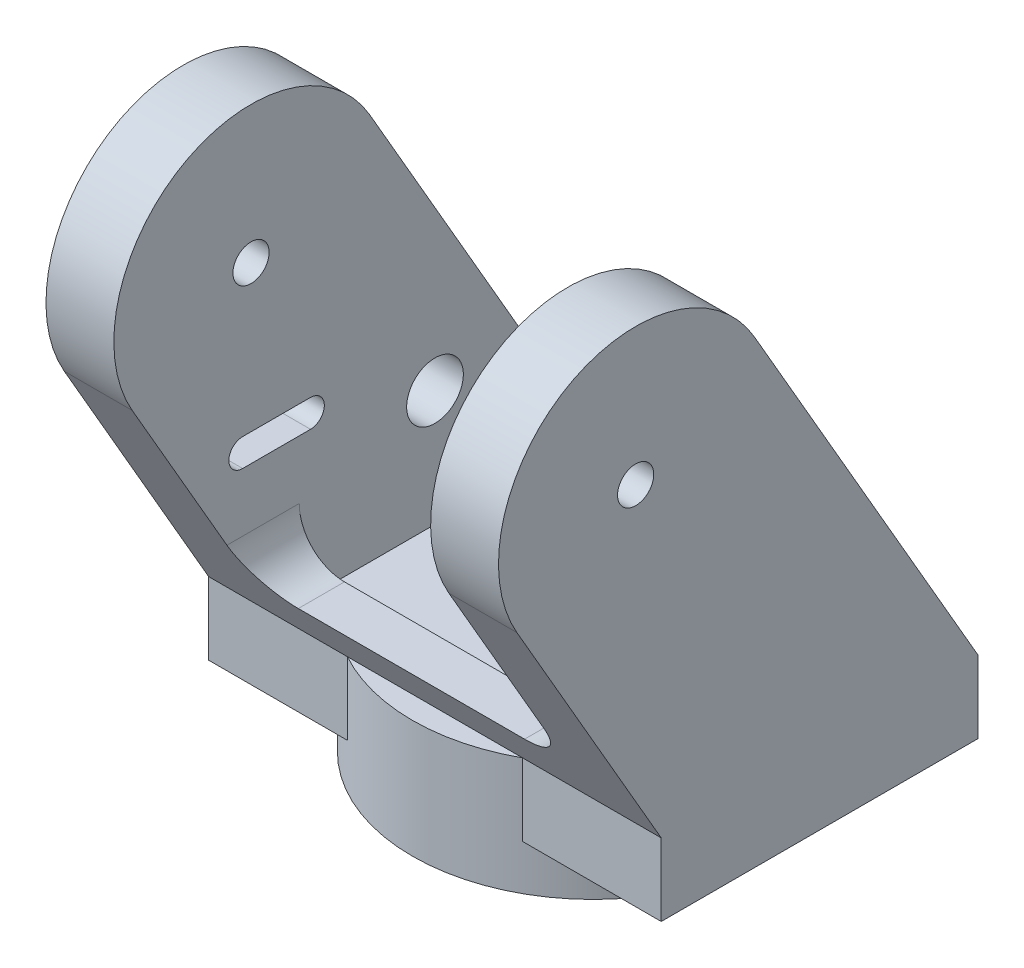
ISO-10303-21;
HEADER;
FILE_DESCRIPTION(('STEP AP214'),'2;1');
FILE_NAME('part.step','',(''),(''),'','','');
FILE_SCHEMA(('AUTOMOTIVE_DESIGN { 1 0 10303 214 1 1 1 1 }'));
ENDSEC;
DATA;
#1=APPLICATION_CONTEXT('core data for automotive mechanical design processes');
#2=APPLICATION_PROTOCOL_DEFINITION('international standard','automotive_design',2000,#1);
#3=PRODUCT_CONTEXT('',#1,'mechanical');
#4=PRODUCT('Part','Part','',(#3));
#5=PRODUCT_RELATED_PRODUCT_CATEGORY('part','',(#4));
#6=PRODUCT_DEFINITION_FORMATION('','',#4);
#7=PRODUCT_DEFINITION_CONTEXT('part definition',#1,'design');
#8=PRODUCT_DEFINITION('design','',#6,#7);
#9=PRODUCT_DEFINITION_SHAPE('','',#8);
#10=(LENGTH_UNIT() NAMED_UNIT(*) SI_UNIT(.MILLI.,.METRE.));
#11=(NAMED_UNIT(*) PLANE_ANGLE_UNIT() SI_UNIT($,.RADIAN.));
#12=(NAMED_UNIT(*) SI_UNIT($,.STERADIAN.) SOLID_ANGLE_UNIT());
#13=UNCERTAINTY_MEASURE_WITH_UNIT(LENGTH_MEASURE(1.E-05),#10,'distance_accuracy_value','');
#14=(GEOMETRIC_REPRESENTATION_CONTEXT(3) GLOBAL_UNCERTAINTY_ASSIGNED_CONTEXT((#13)) GLOBAL_UNIT_ASSIGNED_CONTEXT((#10,
#11,#12)) REPRESENTATION_CONTEXT('',''));
#15=CARTESIAN_POINT('',(0.,0.,0.));
#16=DIRECTION('',(0.,0.,1.));
#17=DIRECTION('',(1.,0.,0.));
#18=AXIS2_PLACEMENT_3D('',#15,#16,#17);
#19=CARTESIAN_POINT('',(0.,26.,0.));
#20=DIRECTION('',(0.,1.,0.));
#21=DIRECTION('',(0.,0.,1.));
#22=AXIS2_PLACEMENT_3D('',#19,#20,#21);
#23=PLANE('',#22);
#24=CARTESIAN_POINT('',(0.,26.,0.));
#25=DIRECTION('',(0.,1.,0.));
#26=DIRECTION('',(0.,0.,1.));
#27=AXIS2_PLACEMENT_3D('',#24,#25,#26);
#28=CIRCLE('',#27,40.);
#29=CARTESIAN_POINT('',(-19.3649167310371,26.,35.));
#30=VERTEX_POINT('',#29);
#31=CARTESIAN_POINT('',(19.3649167310371,26.,35.));
#32=VERTEX_POINT('',#31);
#33=EDGE_CURVE('E250',#30,#32,#28,.T.);
#34=ORIENTED_EDGE('',*,*,#33,.T.);
#35=DIRECTION('',(-1.,0.,0.));
#36=VECTOR('',#35,1.);
#37=CARTESIAN_POINT('',(50.,26.,35.));
#38=LINE('',#37,#36);
#39=EDGE_CURVE('E192',#32,#30,#38,.T.);
#40=ORIENTED_EDGE('',*,*,#39,.T.);
#41=EDGE_LOOP('',(#34,#40));
#42=FACE_BOUND('',#41,.T.);
#43=ADVANCED_FACE('F35',(#42),#23,.T.);
#44=DIRECTION('',(0.,0.,1.));
#45=VECTOR('',#44,1.);
#46=CARTESIAN_POINT('',(-35.,26.,35.));
#47=LINE('',#46,#45);
#48=CARTESIAN_POINT('',(-35.,26.,-35.));
#49=VERTEX_POINT('',#48);
#50=CARTESIAN_POINT('',(-35.,26.,30.));
#51=VERTEX_POINT('',#50);
#52=EDGE_CURVE('E199',#49,#51,#47,.T.);
#53=ORIENTED_EDGE('',*,*,#52,.T.);
#54=DIRECTION('',(-1.,0.,0.));
#55=VECTOR('',#54,1.);
#56=CARTESIAN_POINT('',(50.,26.,30.));
#57=LINE('',#56,#55);
#58=CARTESIAN_POINT('',(35.,26.,30.));
#59=VERTEX_POINT('',#58);
#60=EDGE_CURVE('E182',#59,#51,#57,.T.);
#61=ORIENTED_EDGE('',*,*,#60,.F.);
#62=DIRECTION('',(0.,0.,1.));
#63=VECTOR('',#62,1.);
#64=CARTESIAN_POINT('',(35.,26.,35.));
#65=LINE('',#64,#63);
#66=CARTESIAN_POINT('',(35.,26.,-35.));
#67=VERTEX_POINT('',#66);
#68=EDGE_CURVE('E213',#67,#59,#65,.T.);
#69=ORIENTED_EDGE('',*,*,#68,.F.);
#70=DIRECTION('',(1.,0.,0.));
#71=VECTOR('',#70,1.);
#72=CARTESIAN_POINT('',(-35.,26.,-35.));
#73=LINE('',#72,#71);
#74=CARTESIAN_POINT('',(19.3649167310371,26.,-35.));
#75=VERTEX_POINT('',#74);
#76=EDGE_CURVE('E212',#75,#67,#73,.T.);
#77=ORIENTED_EDGE('',*,*,#76,.F.);
#78=CARTESIAN_POINT('',(-19.3649167310371,26.,-35.));
#79=VERTEX_POINT('',#78);
#80=EDGE_CURVE('E253',#75,#79,#28,.T.);
#81=ORIENTED_EDGE('',*,*,#80,.T.);
#82=EDGE_CURVE('E211',#49,#79,#73,.T.);
#83=ORIENTED_EDGE('',*,*,#82,.F.);
#84=EDGE_LOOP('',(#53,#61,#69,#77,#81,#83));
#85=FACE_BOUND('',#84,.T.);
#86=ADVANCED_FACE('F208',(#85),#23,.T.);
#87=CARTESIAN_POINT('',(-35.,96.4084709789309,40.6503496729154));
#88=DIRECTION('',(1.,0.,0.));
#89=DIRECTION('',(0.,0.,-1.));
#90=AXIS2_PLACEMENT_3D('',#87,#88,#89);
#91=PLANE('',#90);
#92=CARTESIAN_POINT('',(-35.,96.4084709789309,40.6503496729154));
#93=DIRECTION('',(1.,0.,0.));
#94=DIRECTION('',(0.,0.,-1.));
#95=AXIS2_PLACEMENT_3D('',#92,#93,#94);
#96=CIRCLE('',#95,4.00000000000001);
#97=CARTESIAN_POINT('',(-35.,96.4084709789309,36.6503496729154));
#98=VERTEX_POINT('',#97);
#99=EDGE_CURVE('E262',#98,#98,#96,.T.);
#100=ORIENTED_EDGE('',*,*,#99,.F.);
#101=EDGE_LOOP('',(#100));
#102=FACE_BOUND('',#101,.T.);
#103=CARTESIAN_POINT('',(-35.,51.6,0.));
#104=DIRECTION('',(-1.,0.,0.));
#105=DIRECTION('',(0.,0.,1.));
#106=AXIS2_PLACEMENT_3D('',#103,#104,#105);
#107=CIRCLE('',#106,6.265);
#108=CARTESIAN_POINT('',(-35.,51.6,6.265));
#109=VERTEX_POINT('',#108);
#110=EDGE_CURVE('E337',#109,#109,#107,.T.);
#111=ORIENTED_EDGE('',*,*,#110,.T.);
#112=EDGE_LOOP('',(#111));
#113=FACE_BOUND('',#112,.T.);
#114=DIRECTION('',(0.,0.,-1.));
#115=VECTOR('',#114,1.);
#116=CARTESIAN_POINT('',(-35.,64.05,27.5));
#117=LINE('',#116,#115);
#118=CARTESIAN_POINT('',(-35.,64.05,42.5));
#119=VERTEX_POINT('',#118);
#120=CARTESIAN_POINT('',(-35.,64.05,27.5));
#121=VERTEX_POINT('',#120);
#122=EDGE_CURVE('E310',#119,#121,#117,.T.);
#123=ORIENTED_EDGE('',*,*,#122,.T.);
#124=CARTESIAN_POINT('',(-35.,61.,27.5));
#125=DIRECTION('',(-1.,0.,0.));
#126=DIRECTION('',(0.,0.,1.));
#127=AXIS2_PLACEMENT_3D('',#124,#125,#126);
#128=CIRCLE('',#127,3.05);
#129=CARTESIAN_POINT('',(-35.,57.95,27.5));
#130=VERTEX_POINT('',#129);
#131=EDGE_CURVE('E306',#121,#130,#128,.T.);
#132=ORIENTED_EDGE('',*,*,#131,.T.);
#133=DIRECTION('',(0.,0.,1.));
#134=VECTOR('',#133,1.);
#135=CARTESIAN_POINT('',(-35.,57.95,27.5));
#136=LINE('',#135,#134);
#137=CARTESIAN_POINT('',(-35.,57.95,42.5));
#138=VERTEX_POINT('',#137);
#139=EDGE_CURVE('E320',#130,#138,#136,.T.);
#140=ORIENTED_EDGE('',*,*,#139,.T.);
#141=CARTESIAN_POINT('',(-35.,61.,42.5));
#142=DIRECTION('',(-1.,0.,0.));
#143=DIRECTION('',(0.,0.,1.));
#144=AXIS2_PLACEMENT_3D('',#141,#142,#143);
#145=CIRCLE('',#144,3.05);
#146=EDGE_CURVE('E323',#138,#119,#145,.T.);
#147=ORIENTED_EDGE('',*,*,#146,.T.);
#148=EDGE_LOOP('',(#123,#132,#140,#147));
#149=FACE_BOUND('',#148,.T.);
#150=DIRECTION('',(0.,0.86602540378444,0.499999999999998));
#151=VECTOR('',#150,1.);
#152=CARTESIAN_POINT('',(-35.,81.2530264127031,66.9003496729155));
#153=LINE('',#152,#151);
#154=CARTESIAN_POINT('',(-35.,45.,45.9696551146028));
#155=VERTEX_POINT('',#154);
#156=CARTESIAN_POINT('',(-35.,81.2530264127031,66.9003496729155));
#157=VERTEX_POINT('',#156);
#158=EDGE_CURVE('E341',#155,#157,#153,.T.);
#159=ORIENTED_EDGE('',*,*,#158,.F.);
#160=DIRECTION('',(0.,0.,1.));
#161=VECTOR('',#160,1.);
#162=CARTESIAN_POINT('',(-35.,45.,40.6503496729154));
#163=LINE('',#162,#161);
#164=CARTESIAN_POINT('',(-35.,45.,30.));
#165=VERTEX_POINT('',#164);
#166=EDGE_CURVE('E202',#155,#165,#163,.F.);
#167=ORIENTED_EDGE('',*,*,#166,.T.);
#168=DIRECTION('',(0.,1.,0.));
#169=VECTOR('',#168,1.);
#170=CARTESIAN_POINT('',(-35.,35.,30.));
#171=LINE('',#170,#169);
#172=EDGE_CURVE('E186',#51,#165,#171,.T.);
#173=ORIENTED_EDGE('',*,*,#172,.F.);
#174=ORIENTED_EDGE('',*,*,#52,.F.);
#175=DIRECTION('',(0.,-0.86602540378444,-0.499999999999998));
#176=VECTOR('',#175,1.);
#177=CARTESIAN_POINT('',(-35.,26.,-35.));
#178=LINE('',#177,#176);
#179=CARTESIAN_POINT('',(-35.,111.563915545159,14.4003496729154));
#180=VERTEX_POINT('',#179);
#181=EDGE_CURVE('E348',#180,#49,#178,.T.);
#182=ORIENTED_EDGE('',*,*,#181,.F.);
#183=CARTESIAN_POINT('',(-35.,96.4084709789309,40.6503496729154));
#184=DIRECTION('',(-1.,0.,0.));
#185=DIRECTION('',(0.,0.,-1.));
#186=AXIS2_PLACEMENT_3D('',#183,#184,#185);
#187=CIRCLE('',#186,30.3108891324554);
#188=EDGE_CURVE('E362',#157,#180,#187,.T.);
#189=ORIENTED_EDGE('',*,*,#188,.F.);
#190=EDGE_LOOP('',(#159,#167,#173,#174,#182,#189));
#191=FACE_BOUND('',#190,.T.);
#192=ADVANCED_FACE('F197',(#102,#113,#149,#191),#91,.T.);
#193=CARTESIAN_POINT('',(35.,96.4084709789309,40.6503496729154));
#194=DIRECTION('',(-1.,0.,0.));
#195=DIRECTION('',(0.,0.,-1.));
#196=AXIS2_PLACEMENT_3D('',#193,#194,#195);
#197=PLANE('',#196);
#198=CARTESIAN_POINT('',(35.,96.4084709789309,40.6503496729154));
#199=DIRECTION('',(-1.,0.,0.));
#200=DIRECTION('',(0.,0.,1.));
#201=AXIS2_PLACEMENT_3D('',#198,#199,#200);
#202=CIRCLE('',#201,4.00000000000001);
#203=CARTESIAN_POINT('',(35.,96.4084709789309,44.6503496729154));
#204=VERTEX_POINT('',#203);
#205=EDGE_CURVE('E259',#204,#204,#202,.T.);
#206=ORIENTED_EDGE('',*,*,#205,.F.);
#207=EDGE_LOOP('',(#206));
#208=FACE_BOUND('',#207,.T.);
#209=DIRECTION('',(0.,1.,0.));
#210=VECTOR('',#209,1.);
#211=CARTESIAN_POINT('',(35.,96.4084709789309,30.));
#212=LINE('',#211,#210);
#213=CARTESIAN_POINT('',(35.,45.,30.));
#214=VERTEX_POINT('',#213);
#215=EDGE_CURVE('E188',#59,#214,#212,.T.);
#216=ORIENTED_EDGE('',*,*,#215,.T.);
#217=DIRECTION('',(0.,0.,1.));
#218=VECTOR('',#217,1.);
#219=CARTESIAN_POINT('',(35.,45.,40.6503496729154));
#220=LINE('',#219,#218);
#221=CARTESIAN_POINT('',(35.,45.,45.9696551146028));
#222=VERTEX_POINT('',#221);
#223=EDGE_CURVE('E273',#214,#222,#220,.T.);
#224=ORIENTED_EDGE('',*,*,#223,.T.);
#225=DIRECTION('',(0.,0.86602540378444,0.499999999999998));
#226=VECTOR('',#225,1.);
#227=CARTESIAN_POINT('',(35.,81.2530264127031,66.9003496729155));
#228=LINE('',#227,#226);
#229=CARTESIAN_POINT('',(35.,81.2530264127031,66.9003496729155));
#230=VERTEX_POINT('',#229);
#231=EDGE_CURVE('E280',#222,#230,#228,.T.);
#232=ORIENTED_EDGE('',*,*,#231,.T.);
#233=CARTESIAN_POINT('',(35.,96.4084709789309,40.6503496729154));
#234=DIRECTION('',(-1.,0.,0.));
#235=DIRECTION('',(0.,0.,-1.));
#236=AXIS2_PLACEMENT_3D('',#233,#234,#235);
#237=CIRCLE('',#236,30.3108891324554);
#238=CARTESIAN_POINT('',(35.,111.563915545159,14.4003496729154));
#239=VERTEX_POINT('',#238);
#240=EDGE_CURVE('E290',#230,#239,#237,.T.);
#241=ORIENTED_EDGE('',*,*,#240,.T.);
#242=DIRECTION('',(0.,-0.86602540378444,-0.499999999999998));
#243=VECTOR('',#242,1.);
#244=CARTESIAN_POINT('',(35.,26.,-35.));
#245=LINE('',#244,#243);
#246=EDGE_CURVE('E295',#239,#67,#245,.T.);
#247=ORIENTED_EDGE('',*,*,#246,.T.);
#248=ORIENTED_EDGE('',*,*,#68,.T.);
#249=EDGE_LOOP('',(#216,#224,#232,#241,#247,#248));
#250=FACE_BOUND('',#249,.T.);
#251=ADVANCED_FACE('F278',(#208,#250),#197,.T.);
#252=CARTESIAN_POINT('',(0.,26.,0.));
#253=DIRECTION('',(0.,-1.,0.));
#254=DIRECTION('',(0.,0.,-1.));
#255=AXIS2_PLACEMENT_3D('',#252,#253,#254);
#256=CYLINDRICAL_SURFACE('',#255,40.);
#257=CARTESIAN_POINT('',(0.,0.,0.));
#258=DIRECTION('',(0.,1.,0.));
#259=DIRECTION('',(0.,0.,1.));
#260=AXIS2_PLACEMENT_3D('',#257,#258,#259);
#261=CIRCLE('',#260,40.);
#262=CARTESIAN_POINT('',(0.,0.,40.));
#263=VERTEX_POINT('',#262);
#264=EDGE_CURVE('E247',#263,#263,#261,.T.);
#265=ORIENTED_EDGE('',*,*,#264,.T.);
#266=EDGE_LOOP('',(#265));
#267=FACE_BOUND('',#266,.T.);
#268=CARTESIAN_POINT('',(0.,10.,0.));
#269=DIRECTION('',(0.,-1.,0.));
#270=DIRECTION('',(0.,0.,-1.));
#271=AXIS2_PLACEMENT_3D('',#268,#269,#270);
#272=CIRCLE('',#271,40.);
#273=CARTESIAN_POINT('',(19.3649167310371,10.,-35.));
#274=VERTEX_POINT('',#273);
#275=CARTESIAN_POINT('',(19.3649167310371,10.,35.));
#276=VERTEX_POINT('',#275);
#277=EDGE_CURVE('E256',#274,#276,#272,.T.);
#278=ORIENTED_EDGE('',*,*,#277,.T.);
#279=DIRECTION('',(0.,-1.,0.));
#280=VECTOR('',#279,1.);
#281=CARTESIAN_POINT('',(19.3649167310371,26.,35.));
#282=LINE('',#281,#280);
#283=EDGE_CURVE('E224',#276,#32,#282,.F.);
#284=ORIENTED_EDGE('',*,*,#283,.T.);
#285=ORIENTED_EDGE('',*,*,#33,.F.);
#286=DIRECTION('',(0.,-1.,0.));
#287=VECTOR('',#286,1.);
#288=CARTESIAN_POINT('',(-19.3649167310371,26.,35.));
#289=LINE('',#288,#287);
#290=CARTESIAN_POINT('',(-19.3649167310371,10.,35.));
#291=VERTEX_POINT('',#290);
#292=EDGE_CURVE('E235',#30,#291,#289,.T.);
#293=ORIENTED_EDGE('',*,*,#292,.T.);
#294=CARTESIAN_POINT('',(-19.3649167310371,10.,-35.));
#295=VERTEX_POINT('',#294);
#296=EDGE_CURVE('E258',#291,#295,#272,.T.);
#297=ORIENTED_EDGE('',*,*,#296,.T.);
#298=DIRECTION('',(0.,-1.,0.));
#299=VECTOR('',#298,1.);
#300=CARTESIAN_POINT('',(-19.3649167310371,26.,-35.));
#301=LINE('',#300,#299);
#302=EDGE_CURVE('E238',#295,#79,#301,.F.);
#303=ORIENTED_EDGE('',*,*,#302,.T.);
#304=ORIENTED_EDGE('',*,*,#80,.F.);
#305=DIRECTION('',(0.,-1.,0.));
#306=VECTOR('',#305,1.);
#307=CARTESIAN_POINT('',(19.3649167310371,26.,-35.));
#308=LINE('',#307,#306);
#309=EDGE_CURVE('E240',#75,#274,#308,.T.);
#310=ORIENTED_EDGE('',*,*,#309,.T.);
#311=EDGE_LOOP('',(#278,#284,#285,#293,#297,#303,#304,#310));
#312=FACE_BOUND('',#311,.T.);
#313=ADVANCED_FACE('F403',(#267,#312),#256,.T.);
#314=CARTESIAN_POINT('',(0.,0.,0.));
#315=DIRECTION('',(0.,1.,0.));
#316=DIRECTION('',(0.,0.,1.));
#317=AXIS2_PLACEMENT_3D('',#314,#315,#316);
#318=PLANE('',#317);
#319=CARTESIAN_POINT('',(0.,0.,0.));
#320=DIRECTION('',(0.,-1.,0.));
#321=DIRECTION('',(0.,0.,-1.));
#322=AXIS2_PLACEMENT_3D('',#319,#320,#321);
#323=CIRCLE('',#322,23.5);
#324=CARTESIAN_POINT('',(0.,0.,-23.5));
#325=VERTEX_POINT('',#324);
#326=EDGE_CURVE('E243',#325,#325,#323,.T.);
#327=ORIENTED_EDGE('',*,*,#326,.F.);
#328=EDGE_LOOP('',(#327));
#329=FACE_BOUND('',#328,.T.);
#330=ORIENTED_EDGE('',*,*,#264,.F.);
#331=EDGE_LOOP('',(#330));
#332=FACE_BOUND('',#331,.T.);
#333=ADVANCED_FACE('F397',(#329,#332),#318,.F.);
#334=CARTESIAN_POINT('',(0.,5.,0.));
#335=DIRECTION('',(0.,-1.,0.));
#336=DIRECTION('',(0.,0.,-1.));
#337=AXIS2_PLACEMENT_3D('',#334,#335,#336);
#338=CYLINDRICAL_SURFACE('',#337,23.5);
#339=CARTESIAN_POINT('',(0.,5.,0.));
#340=DIRECTION('',(0.,-1.,0.));
#341=DIRECTION('',(0.,0.,-1.));
#342=AXIS2_PLACEMENT_3D('',#339,#340,#341);
#343=CIRCLE('',#342,23.5);
#344=CARTESIAN_POINT('',(0.,5.,-23.5));
#345=VERTEX_POINT('',#344);
#346=EDGE_CURVE('E244',#345,#345,#343,.T.);
#347=ORIENTED_EDGE('',*,*,#346,.F.);
#348=EDGE_LOOP('',(#347));
#349=FACE_BOUND('',#348,.T.);
#350=ORIENTED_EDGE('',*,*,#326,.T.);
#351=EDGE_LOOP('',(#350));
#352=FACE_BOUND('',#351,.T.);
#353=ADVANCED_FACE('F390',(#349,#352),#338,.F.);
#354=CARTESIAN_POINT('',(0.,5.,0.));
#355=DIRECTION('',(0.,-1.,0.));
#356=DIRECTION('',(0.,0.,-1.));
#357=AXIS2_PLACEMENT_3D('',#354,#355,#356);
#358=PLANE('',#357);
#359=CARTESIAN_POINT('',(12.,5.,0.));
#360=DIRECTION('',(0.,-1.,0.));
#361=DIRECTION('',(0.,0.,-1.));
#362=AXIS2_PLACEMENT_3D('',#359,#360,#361);
#363=CIRCLE('',#362,1.5);
#364=CARTESIAN_POINT('',(12.,5.,-1.5));
#365=VERTEX_POINT('',#364);
#366=EDGE_CURVE('E955',#365,#365,#363,.T.);
#367=ORIENTED_EDGE('',*,*,#366,.F.);
#368=EDGE_LOOP('',(#367));
#369=FACE_BOUND('',#368,.T.);
#370=CARTESIAN_POINT('',(0.,5.,-12.));
#371=DIRECTION('',(0.,-1.,0.));
#372=DIRECTION('',(0.,0.,-1.));
#373=AXIS2_PLACEMENT_3D('',#370,#371,#372);
#374=CIRCLE('',#373,1.5);
#375=CARTESIAN_POINT('',(0.,5.,-13.5));
#376=VERTEX_POINT('',#375);
#377=EDGE_CURVE('E963',#376,#376,#374,.T.);
#378=ORIENTED_EDGE('',*,*,#377,.F.);
#379=EDGE_LOOP('',(#378));
#380=FACE_BOUND('',#379,.T.);
#381=CARTESIAN_POINT('',(-12.,5.,0.));
#382=DIRECTION('',(0.,-1.,0.));
#383=DIRECTION('',(0.,0.,-1.));
#384=AXIS2_PLACEMENT_3D('',#381,#382,#383);
#385=CIRCLE('',#384,1.5);
#386=CARTESIAN_POINT('',(-12.,5.,-1.49999999999992));
#387=VERTEX_POINT('',#386);
#388=EDGE_CURVE('E969',#387,#387,#385,.T.);
#389=ORIENTED_EDGE('',*,*,#388,.F.);
#390=EDGE_LOOP('',(#389));
#391=FACE_BOUND('',#390,.T.);
#392=CARTESIAN_POINT('',(1.25693328198353E-13,5.,12.));
#393=DIRECTION('',(0.,-1.,0.));
#394=DIRECTION('',(0.,0.,-1.));
#395=AXIS2_PLACEMENT_3D('',#392,#393,#394);
#396=CIRCLE('',#395,1.5);
#397=CARTESIAN_POINT('',(1.25693328198353E-13,5.,10.5));
#398=VERTEX_POINT('',#397);
#399=EDGE_CURVE('E975',#398,#398,#396,.T.);
#400=ORIENTED_EDGE('',*,*,#399,.F.);
#401=EDGE_LOOP('',(#400));
#402=FACE_BOUND('',#401,.T.);
#403=CARTESIAN_POINT('',(0.,5.,0.));
#404=DIRECTION('',(0.,-1.,0.));
#405=DIRECTION('',(0.,0.,-1.));
#406=AXIS2_PLACEMENT_3D('',#403,#404,#405);
#407=CIRCLE('',#406,8.75);
#408=CARTESIAN_POINT('',(0.,5.,-8.75));
#409=VERTEX_POINT('',#408);
#410=EDGE_CURVE('E377',#409,#409,#407,.T.);
#411=ORIENTED_EDGE('',*,*,#410,.F.);
#412=EDGE_LOOP('',(#411));
#413=FACE_BOUND('',#412,.T.);
#414=ORIENTED_EDGE('',*,*,#346,.T.);
#415=EDGE_LOOP('',(#414));
#416=FACE_BOUND('',#415,.T.);
#417=ADVANCED_FACE('F386',(#369,#380,#391,#402,#413,#416),#358,.T.);
#418=CARTESIAN_POINT('',(-35.,26.,-35.));
#419=DIRECTION('',(0.,0.,-1.));
#420=DIRECTION('',(-1.,0.,0.));
#421=AXIS2_PLACEMENT_3D('',#418,#419,#420);
#422=PLANE('',#421);
#423=ORIENTED_EDGE('',*,*,#309,.F.);
#424=ORIENTED_EDGE('',*,*,#76,.T.);
#425=DIRECTION('',(-1.,0.,0.));
#426=VECTOR('',#425,1.);
#427=CARTESIAN_POINT('',(50.,26.,-35.));
#428=LINE('',#427,#426);
#429=CARTESIAN_POINT('',(50.,26.,-35.));
#430=VERTEX_POINT('',#429);
#431=EDGE_CURVE('E303',#430,#67,#428,.T.);
#432=ORIENTED_EDGE('',*,*,#431,.F.);
#433=DIRECTION('',(0.,-1.,0.));
#434=VECTOR('',#433,1.);
#435=CARTESIAN_POINT('',(50.,10.,-35.));
#436=LINE('',#435,#434);
#437=CARTESIAN_POINT('',(50.,10.,-35.));
#438=VERTEX_POINT('',#437);
#439=EDGE_CURVE('E293',#430,#438,#436,.T.);
#440=ORIENTED_EDGE('',*,*,#439,.T.);
#441=DIRECTION('',(1.,0.,0.));
#442=VECTOR('',#441,1.);
#443=CARTESIAN_POINT('',(-35.,10.,-35.));
#444=LINE('',#443,#442);
#445=EDGE_CURVE('E225',#274,#438,#444,.T.);
#446=ORIENTED_EDGE('',*,*,#445,.F.);
#447=EDGE_LOOP('',(#423,#424,#432,#440,#446));
#448=FACE_BOUND('',#447,.T.);
#449=ADVANCED_FACE('F389',(#448),#422,.T.);
#450=CARTESIAN_POINT('',(-35.,10.,35.));
#451=DIRECTION('',(0.,-1.,0.));
#452=DIRECTION('',(0.,0.,-1.));
#453=AXIS2_PLACEMENT_3D('',#450,#451,#452);
#454=PLANE('',#453);
#455=ORIENTED_EDGE('',*,*,#277,.F.);
#456=ORIENTED_EDGE('',*,*,#445,.T.);
#457=DIRECTION('',(0.,0.,1.));
#458=VECTOR('',#457,1.);
#459=CARTESIAN_POINT('',(50.,10.,35.));
#460=LINE('',#459,#458);
#461=CARTESIAN_POINT('',(50.,10.,35.));
#462=VERTEX_POINT('',#461);
#463=EDGE_CURVE('E289',#438,#462,#460,.T.);
#464=ORIENTED_EDGE('',*,*,#463,.T.);
#465=DIRECTION('',(1.,0.,0.));
#466=VECTOR('',#465,1.);
#467=CARTESIAN_POINT('',(-35.,10.,35.));
#468=LINE('',#467,#466);
#469=EDGE_CURVE('E229',#276,#462,#468,.T.);
#470=ORIENTED_EDGE('',*,*,#469,.F.);
#471=EDGE_LOOP('',(#455,#456,#464,#470));
#472=FACE_BOUND('',#471,.T.);
#473=ADVANCED_FACE('F420',(#472),#454,.T.);
#474=CARTESIAN_POINT('',(-35.,26.,35.));
#475=DIRECTION('',(0.,0.,1.));
#476=DIRECTION('',(1.,0.,0.));
#477=AXIS2_PLACEMENT_3D('',#474,#475,#476);
#478=PLANE('',#477);
#479=ORIENTED_EDGE('',*,*,#283,.F.);
#480=ORIENTED_EDGE('',*,*,#469,.T.);
#481=DIRECTION('',(0.,1.,0.));
#482=VECTOR('',#481,1.);
#483=CARTESIAN_POINT('',(50.,26.,35.));
#484=LINE('',#483,#482);
#485=CARTESIAN_POINT('',(50.,26.,35.));
#486=VERTEX_POINT('',#485);
#487=EDGE_CURVE('E301',#462,#486,#484,.T.);
#488=ORIENTED_EDGE('',*,*,#487,.T.);
#489=DIRECTION('',(1.,0.,0.));
#490=VECTOR('',#489,1.);
#491=CARTESIAN_POINT('',(-35.,26.,35.));
#492=LINE('',#491,#490);
#493=EDGE_CURVE('E231',#32,#486,#492,.T.);
#494=ORIENTED_EDGE('',*,*,#493,.F.);
#495=EDGE_LOOP('',(#479,#480,#488,#494));
#496=FACE_BOUND('',#495,.T.);
#497=ADVANCED_FACE('F418',(#496),#478,.T.);
#498=ORIENTED_EDGE('',*,*,#302,.F.);
#499=CARTESIAN_POINT('',(-50.,10.,-35.));
#500=VERTEX_POINT('',#499);
#501=EDGE_CURVE('E221',#500,#295,#444,.T.);
#502=ORIENTED_EDGE('',*,*,#501,.F.);
#503=DIRECTION('',(0.,-1.,0.));
#504=VECTOR('',#503,1.);
#505=CARTESIAN_POINT('',(-50.,10.,-35.));
#506=LINE('',#505,#504);
#507=CARTESIAN_POINT('',(-50.,26.,-35.));
#508=VERTEX_POINT('',#507);
#509=EDGE_CURVE('E357',#508,#500,#506,.T.);
#510=ORIENTED_EDGE('',*,*,#509,.F.);
#511=DIRECTION('',(1.,0.,0.));
#512=VECTOR('',#511,1.);
#513=CARTESIAN_POINT('',(-50.,26.,-35.));
#514=LINE('',#513,#512);
#515=EDGE_CURVE('E360',#508,#49,#514,.T.);
#516=ORIENTED_EDGE('',*,*,#515,.T.);
#517=ORIENTED_EDGE('',*,*,#82,.T.);
#518=EDGE_LOOP('',(#498,#502,#510,#516,#517));
#519=FACE_BOUND('',#518,.T.);
#520=ADVANCED_FACE('F458',(#519),#422,.T.);
#521=ORIENTED_EDGE('',*,*,#296,.F.);
#522=CARTESIAN_POINT('',(-50.,10.,35.));
#523=VERTEX_POINT('',#522);
#524=EDGE_CURVE('E226',#523,#291,#468,.T.);
#525=ORIENTED_EDGE('',*,*,#524,.F.);
#526=DIRECTION('',(0.,0.,1.));
#527=VECTOR('',#526,1.);
#528=CARTESIAN_POINT('',(-50.,10.,35.));
#529=LINE('',#528,#527);
#530=EDGE_CURVE('E344',#500,#523,#529,.T.);
#531=ORIENTED_EDGE('',*,*,#530,.F.);
#532=ORIENTED_EDGE('',*,*,#501,.T.);
#533=EDGE_LOOP('',(#521,#525,#531,#532));
#534=FACE_BOUND('',#533,.T.);
#535=ADVANCED_FACE('F462',(#534),#454,.T.);
#536=ORIENTED_EDGE('',*,*,#292,.F.);
#537=CARTESIAN_POINT('',(-50.,26.,35.));
#538=VERTEX_POINT('',#537);
#539=EDGE_CURVE('E230',#538,#30,#492,.T.);
#540=ORIENTED_EDGE('',*,*,#539,.F.);
#541=DIRECTION('',(0.,1.,0.));
#542=VECTOR('',#541,1.);
#543=CARTESIAN_POINT('',(-50.,26.,35.));
#544=LINE('',#543,#542);
#545=EDGE_CURVE('E347',#523,#538,#544,.T.);
#546=ORIENTED_EDGE('',*,*,#545,.F.);
#547=ORIENTED_EDGE('',*,*,#524,.T.);
#548=EDGE_LOOP('',(#536,#540,#546,#547));
#549=FACE_BOUND('',#548,.T.);
#550=ADVANCED_FACE('F827',(#549),#478,.T.);
#551=CARTESIAN_POINT('',(0.,15.,0.));
#552=DIRECTION('',(0.,-1.,0.));
#553=DIRECTION('',(0.,0.,-1.));
#554=AXIS2_PLACEMENT_3D('',#551,#552,#553);
#555=CYLINDRICAL_SURFACE('',#554,8.75);
#556=CARTESIAN_POINT('',(0.,15.,0.));
#557=DIRECTION('',(0.,-1.,0.));
#558=DIRECTION('',(0.,0.,-1.));
#559=AXIS2_PLACEMENT_3D('',#556,#557,#558);
#560=CIRCLE('',#559,8.75);
#561=CARTESIAN_POINT('',(0.,15.,-8.75));
#562=VERTEX_POINT('',#561);
#563=EDGE_CURVE('E217',#562,#562,#560,.T.);
#564=ORIENTED_EDGE('',*,*,#563,.F.);
#565=EDGE_LOOP('',(#564));
#566=FACE_BOUND('',#565,.T.);
#567=ORIENTED_EDGE('',*,*,#410,.T.);
#568=EDGE_LOOP('',(#567));
#569=FACE_BOUND('',#568,.T.);
#570=ADVANCED_FACE('F384',(#566,#569),#555,.F.);
#571=CARTESIAN_POINT('',(0.,15.,0.));
#572=DIRECTION('',(0.,-1.,0.));
#573=DIRECTION('',(0.,0.,-1.));
#574=AXIS2_PLACEMENT_3D('',#571,#572,#573);
#575=PLANE('',#574);
#576=CARTESIAN_POINT('',(0.,15.,0.));
#577=DIRECTION('',(0.,-1.,0.));
#578=DIRECTION('',(0.,0.,-1.));
#579=AXIS2_PLACEMENT_3D('',#576,#577,#578);
#580=CIRCLE('',#579,4.);
#581=CARTESIAN_POINT('',(0.,15.,-4.));
#582=VERTEX_POINT('',#581);
#583=EDGE_CURVE('E373',#582,#582,#580,.T.);
#584=ORIENTED_EDGE('',*,*,#583,.F.);
#585=EDGE_LOOP('',(#584));
#586=FACE_BOUND('',#585,.T.);
#587=ORIENTED_EDGE('',*,*,#563,.T.);
#588=EDGE_LOOP('',(#587));
#589=FACE_BOUND('',#588,.T.);
#590=ADVANCED_FACE('F860',(#586,#589),#575,.T.);
#591=CARTESIAN_POINT('',(0.,24.4,0.));
#592=DIRECTION('',(0.,-1.,0.));
#593=DIRECTION('',(0.,0.,-1.));
#594=AXIS2_PLACEMENT_3D('',#591,#592,#593);
#595=CYLINDRICAL_SURFACE('',#594,4.);
#596=CARTESIAN_POINT('',(0.,24.4,0.));
#597=DIRECTION('',(0.,-1.,0.));
#598=DIRECTION('',(0.,0.,-1.));
#599=AXIS2_PLACEMENT_3D('',#596,#597,#598);
#600=CIRCLE('',#599,4.);
#601=CARTESIAN_POINT('',(0.,24.4,-4.));
#602=VERTEX_POINT('',#601);
#603=EDGE_CURVE('E374',#602,#602,#600,.T.);
#604=ORIENTED_EDGE('',*,*,#603,.F.);
#605=EDGE_LOOP('',(#604));
#606=FACE_BOUND('',#605,.T.);
#607=ORIENTED_EDGE('',*,*,#583,.T.);
#608=EDGE_LOOP('',(#607));
#609=FACE_BOUND('',#608,.T.);
#610=ADVANCED_FACE('F851',(#606,#609),#595,.F.);
#611=CARTESIAN_POINT('',(0.,24.4,0.));
#612=DIRECTION('',(0.,-1.,0.));
#613=DIRECTION('',(0.,0.,-1.));
#614=AXIS2_PLACEMENT_3D('',#611,#612,#613);
#615=PLANE('',#614);
#616=ORIENTED_EDGE('',*,*,#603,.T.);
#617=EDGE_LOOP('',(#616));
#618=FACE_BOUND('',#617,.T.);
#619=ADVANCED_FACE('F495',(#618),#615,.T.);
#620=CARTESIAN_POINT('',(-50.,96.4084709789309,40.6503496729154));
#621=DIRECTION('',(1.,0.,0.));
#622=DIRECTION('',(0.,0.,-1.));
#623=AXIS2_PLACEMENT_3D('',#620,#621,#622);
#624=PLANE('',#623);
#625=CARTESIAN_POINT('',(-50.,96.4084709789309,40.6503496729154));
#626=DIRECTION('',(-1.,0.,0.));
#627=DIRECTION('',(0.,0.,1.));
#628=AXIS2_PLACEMENT_3D('',#625,#626,#627);
#629=CIRCLE('',#628,4.00000000000001);
#630=CARTESIAN_POINT('',(-50.,96.4084709789309,44.6503496729154));
#631=VERTEX_POINT('',#630);
#632=EDGE_CURVE('E442',#631,#631,#629,.T.);
#633=ORIENTED_EDGE('',*,*,#632,.F.);
#634=EDGE_LOOP('',(#633));
#635=FACE_BOUND('',#634,.T.);
#636=CARTESIAN_POINT('',(-50.,51.6,0.));
#637=DIRECTION('',(-1.,0.,0.));
#638=DIRECTION('',(0.,0.,1.));
#639=AXIS2_PLACEMENT_3D('',#636,#637,#638);
#640=CIRCLE('',#639,6.265);
#641=CARTESIAN_POINT('',(-50.,51.6,6.265));
#642=VERTEX_POINT('',#641);
#643=EDGE_CURVE('E338',#642,#642,#640,.T.);
#644=ORIENTED_EDGE('',*,*,#643,.F.);
#645=EDGE_LOOP('',(#644));
#646=FACE_BOUND('',#645,.T.);
#647=ORIENTED_EDGE('',*,*,#530,.T.);
#648=ORIENTED_EDGE('',*,*,#545,.T.);
#649=DIRECTION('',(0.,0.86602540378444,0.499999999999998));
#650=VECTOR('',#649,1.);
#651=CARTESIAN_POINT('',(-50.,81.2530264127031,66.9003496729155));
#652=LINE('',#651,#650);
#653=CARTESIAN_POINT('',(-50.,81.2530264127031,66.9003496729155));
#654=VERTEX_POINT('',#653);
#655=EDGE_CURVE('E351',#538,#654,#652,.T.);
#656=ORIENTED_EDGE('',*,*,#655,.T.);
#657=CARTESIAN_POINT('',(-50.,96.4084709789309,40.6503496729154));
#658=DIRECTION('',(-1.,0.,0.));
#659=DIRECTION('',(0.,0.,-1.));
#660=AXIS2_PLACEMENT_3D('',#657,#658,#659);
#661=CIRCLE('',#660,30.3108891324554);
#662=CARTESIAN_POINT('',(-50.,111.563915545159,14.4003496729154));
#663=VERTEX_POINT('',#662);
#664=EDGE_CURVE('E353',#654,#663,#661,.T.);
#665=ORIENTED_EDGE('',*,*,#664,.T.);
#666=DIRECTION('',(0.,-0.86602540378444,-0.499999999999998));
#667=VECTOR('',#666,1.);
#668=CARTESIAN_POINT('',(-50.,26.,-35.));
#669=LINE('',#668,#667);
#670=EDGE_CURVE('E355',#663,#508,#669,.T.);
#671=ORIENTED_EDGE('',*,*,#670,.T.);
#672=ORIENTED_EDGE('',*,*,#509,.T.);
#673=EDGE_LOOP('',(#647,#648,#656,#665,#671,#672));
#674=FACE_BOUND('',#673,.T.);
#675=CARTESIAN_POINT('',(-50.,61.,27.5));
#676=DIRECTION('',(-1.,0.,0.));
#677=DIRECTION('',(0.,0.,1.));
#678=AXIS2_PLACEMENT_3D('',#675,#676,#677);
#679=CIRCLE('',#678,3.05);
#680=CARTESIAN_POINT('',(-50.,64.05,27.5));
#681=VERTEX_POINT('',#680);
#682=CARTESIAN_POINT('',(-50.,57.95,27.5));
#683=VERTEX_POINT('',#682);
#684=EDGE_CURVE('E307',#681,#683,#679,.T.);
#685=ORIENTED_EDGE('',*,*,#684,.F.);
#686=DIRECTION('',(0.,0.,-1.));
#687=VECTOR('',#686,1.);
#688=CARTESIAN_POINT('',(-50.,64.05,27.5));
#689=LINE('',#688,#687);
#690=CARTESIAN_POINT('',(-50.,64.05,42.5));
#691=VERTEX_POINT('',#690);
#692=EDGE_CURVE('E315',#691,#681,#689,.T.);
#693=ORIENTED_EDGE('',*,*,#692,.F.);
#694=CARTESIAN_POINT('',(-50.,61.,42.5));
#695=DIRECTION('',(-1.,0.,0.));
#696=DIRECTION('',(0.,0.,1.));
#697=AXIS2_PLACEMENT_3D('',#694,#695,#696);
#698=CIRCLE('',#697,3.05);
#699=CARTESIAN_POINT('',(-50.,57.95,42.5));
#700=VERTEX_POINT('',#699);
#701=EDGE_CURVE('E312',#700,#691,#698,.T.);
#702=ORIENTED_EDGE('',*,*,#701,.F.);
#703=DIRECTION('',(0.,0.,1.));
#704=VECTOR('',#703,1.);
#705=CARTESIAN_POINT('',(-50.,57.95,27.5));
#706=LINE('',#705,#704);
#707=EDGE_CURVE('E309',#683,#700,#706,.T.);
#708=ORIENTED_EDGE('',*,*,#707,.F.);
#709=EDGE_LOOP('',(#685,#693,#702,#708));
#710=FACE_BOUND('',#709,.T.);
#711=ADVANCED_FACE('F465',(#635,#646,#674,#710),#624,.F.);
#712=CARTESIAN_POINT('',(-50.,81.2530264127031,66.9003496729155));
#713=DIRECTION('',(0.,0.499999999999998,-0.86602540378444));
#714=DIRECTION('',(0.,0.86602540378444,0.499999999999998));
#715=AXIS2_PLACEMENT_3D('',#712,#713,#714);
#716=PLANE('',#715);
#717=ORIENTED_EDGE('',*,*,#655,.F.);
#718=ORIENTED_EDGE('',*,*,#539,.T.);
#719=ORIENTED_EDGE('',*,*,#39,.F.);
#720=ORIENTED_EDGE('',*,*,#493,.T.);
#721=DIRECTION('',(0.,0.86602540378444,0.499999999999998));
#722=VECTOR('',#721,1.);
#723=CARTESIAN_POINT('',(50.,81.2530264127031,66.9003496729155));
#724=LINE('',#723,#722);
#725=CARTESIAN_POINT('',(50.,81.2530264127031,66.9003496729155));
#726=VERTEX_POINT('',#725);
#727=EDGE_CURVE('E430',#486,#726,#724,.T.);
#728=ORIENTED_EDGE('',*,*,#727,.T.);
#729=DIRECTION('',(-1.,0.,0.));
#730=VECTOR('',#729,1.);
#731=CARTESIAN_POINT('',(50.,81.2530264127031,66.9003496729155));
#732=LINE('',#731,#730);
#733=EDGE_CURVE('E287',#726,#230,#732,.T.);
#734=ORIENTED_EDGE('',*,*,#733,.T.);
#735=ORIENTED_EDGE('',*,*,#231,.F.);
#736=CARTESIAN_POINT('',(25.,45.,45.9696551146028));
#737=DIRECTION('',(0.,0.499999999999998,-0.86602540378444));
#738=DIRECTION('',(0.,0.86602540378444,0.499999999999998));
#739=AXIS2_PLACEMENT_3D('',#736,#737,#738);
#740=ELLIPSE('',#739,11.5470053837925,10.);
#741=CARTESIAN_POINT('',(25.,35.,40.1961524227066));
#742=VERTEX_POINT('',#741);
#743=EDGE_CURVE('E43',#222,#742,#740,.T.);
#744=ORIENTED_EDGE('',*,*,#743,.T.);
#745=DIRECTION('',(-1.,0.,0.));
#746=VECTOR('',#745,1.);
#747=CARTESIAN_POINT('',(50.,35.,40.1961524227066));
#748=LINE('',#747,#746);
#749=CARTESIAN_POINT('',(-25.,35.,40.1961524227066));
#750=VERTEX_POINT('',#749);
#751=EDGE_CURVE('E204',#742,#750,#748,.T.);
#752=ORIENTED_EDGE('',*,*,#751,.T.);
#753=CARTESIAN_POINT('',(-25.,45.,45.9696551146028));
#754=DIRECTION('',(0.,0.499999999999998,-0.86602540378444));
#755=DIRECTION('',(0.,0.86602540378444,0.499999999999998));
#756=AXIS2_PLACEMENT_3D('',#753,#754,#755);
#757=ELLIPSE('',#756,11.5470053837925,10.);
#758=EDGE_CURVE('E269',#750,#155,#757,.T.);
#759=ORIENTED_EDGE('',*,*,#758,.T.);
#760=ORIENTED_EDGE('',*,*,#158,.T.);
#761=DIRECTION('',(1.,0.,0.));
#762=VECTOR('',#761,1.);
#763=CARTESIAN_POINT('',(-50.,81.2530264127031,66.9003496729155));
#764=LINE('',#763,#762);
#765=EDGE_CURVE('E370',#654,#157,#764,.T.);
#766=ORIENTED_EDGE('',*,*,#765,.F.);
#767=EDGE_LOOP('',(#717,#718,#719,#720,#728,#734,#735,#744,#752,#759,#760,#766));
#768=FACE_BOUND('',#767,.T.);
#769=ADVANCED_FACE('F285',(#768),#716,.F.);
#770=CARTESIAN_POINT('',(-50.,96.4084709789309,40.6503496729154));
#771=DIRECTION('',(1.,0.,0.));
#772=DIRECTION('',(0.,0.,-1.));
#773=AXIS2_PLACEMENT_3D('',#770,#771,#772);
#774=CYLINDRICAL_SURFACE('',#773,30.3108891324554);
#775=ORIENTED_EDGE('',*,*,#188,.T.);
#776=DIRECTION('',(1.,0.,0.));
#777=VECTOR('',#776,1.);
#778=CARTESIAN_POINT('',(-50.,111.563915545159,14.4003496729154));
#779=LINE('',#778,#777);
#780=EDGE_CURVE('E367',#663,#180,#779,.T.);
#781=ORIENTED_EDGE('',*,*,#780,.F.);
#782=ORIENTED_EDGE('',*,*,#664,.F.);
#783=ORIENTED_EDGE('',*,*,#765,.T.);
#784=EDGE_LOOP('',(#775,#781,#782,#783));
#785=FACE_BOUND('',#784,.T.);
#786=ADVANCED_FACE('F474',(#785),#774,.T.);
#787=CARTESIAN_POINT('',(-50.,26.,-35.));
#788=DIRECTION('',(0.,-0.499999999999998,0.86602540378444));
#789=DIRECTION('',(0.,-0.86602540378444,-0.499999999999998));
#790=AXIS2_PLACEMENT_3D('',#787,#788,#789);
#791=PLANE('',#790);
#792=ORIENTED_EDGE('',*,*,#181,.T.);
#793=ORIENTED_EDGE('',*,*,#515,.F.);
#794=ORIENTED_EDGE('',*,*,#670,.F.);
#795=ORIENTED_EDGE('',*,*,#780,.T.);
#796=EDGE_LOOP('',(#792,#793,#794,#795));
#797=FACE_BOUND('',#796,.T.);
#798=ADVANCED_FACE('F470',(#797),#791,.F.);
#799=CARTESIAN_POINT('',(-50.,51.6,0.));
#800=DIRECTION('',(1.,0.,0.));
#801=DIRECTION('',(0.,0.,-1.));
#802=AXIS2_PLACEMENT_3D('',#799,#800,#801);
#803=CYLINDRICAL_SURFACE('',#802,6.265);
#804=ORIENTED_EDGE('',*,*,#643,.T.);
#805=EDGE_LOOP('',(#804));
#806=FACE_BOUND('',#805,.T.);
#807=ORIENTED_EDGE('',*,*,#110,.F.);
#808=EDGE_LOOP('',(#807));
#809=FACE_BOUND('',#808,.T.);
#810=ADVANCED_FACE('F499',(#806,#809),#803,.F.);
#811=CARTESIAN_POINT('',(-50.,61.,27.5));
#812=DIRECTION('',(1.,0.,0.));
#813=DIRECTION('',(0.,0.,-1.));
#814=AXIS2_PLACEMENT_3D('',#811,#812,#813);
#815=CYLINDRICAL_SURFACE('',#814,3.05);
#816=ORIENTED_EDGE('',*,*,#131,.F.);
#817=DIRECTION('',(1.,0.,0.));
#818=VECTOR('',#817,1.);
#819=CARTESIAN_POINT('',(-50.,64.05,27.5));
#820=LINE('',#819,#818);
#821=EDGE_CURVE('E317',#681,#121,#820,.T.);
#822=ORIENTED_EDGE('',*,*,#821,.F.);
#823=ORIENTED_EDGE('',*,*,#684,.T.);
#824=DIRECTION('',(1.,0.,0.));
#825=VECTOR('',#824,1.);
#826=CARTESIAN_POINT('',(-50.,57.95,27.5));
#827=LINE('',#826,#825);
#828=EDGE_CURVE('E334',#683,#130,#827,.T.);
#829=ORIENTED_EDGE('',*,*,#828,.T.);
#830=EDGE_LOOP('',(#816,#822,#823,#829));
#831=FACE_BOUND('',#830,.T.);
#832=ADVANCED_FACE('F502',(#831),#815,.F.);
#833=CARTESIAN_POINT('',(-50.,57.95,27.5));
#834=DIRECTION('',(0.,1.,0.));
#835=DIRECTION('',(0.,0.,1.));
#836=AXIS2_PLACEMENT_3D('',#833,#834,#835);
#837=PLANE('',#836);
#838=ORIENTED_EDGE('',*,*,#139,.F.);
#839=ORIENTED_EDGE('',*,*,#828,.F.);
#840=ORIENTED_EDGE('',*,*,#707,.T.);
#841=DIRECTION('',(1.,0.,0.));
#842=VECTOR('',#841,1.);
#843=CARTESIAN_POINT('',(-50.,57.95,42.5));
#844=LINE('',#843,#842);
#845=EDGE_CURVE('E332',#700,#138,#844,.T.);
#846=ORIENTED_EDGE('',*,*,#845,.T.);
#847=EDGE_LOOP('',(#838,#839,#840,#846));
#848=FACE_BOUND('',#847,.T.);
#849=ADVANCED_FACE('F523',(#848),#837,.T.);
#850=CARTESIAN_POINT('',(-50.,61.,42.5));
#851=DIRECTION('',(1.,0.,0.));
#852=DIRECTION('',(0.,0.,-1.));
#853=AXIS2_PLACEMENT_3D('',#850,#851,#852);
#854=CYLINDRICAL_SURFACE('',#853,3.05);
#855=ORIENTED_EDGE('',*,*,#146,.F.);
#856=ORIENTED_EDGE('',*,*,#845,.F.);
#857=ORIENTED_EDGE('',*,*,#701,.T.);
#858=DIRECTION('',(1.,0.,0.));
#859=VECTOR('',#858,1.);
#860=CARTESIAN_POINT('',(-50.,64.05,42.5));
#861=LINE('',#860,#859);
#862=EDGE_CURVE('E330',#691,#119,#861,.T.);
#863=ORIENTED_EDGE('',*,*,#862,.T.);
#864=EDGE_LOOP('',(#855,#856,#857,#863));
#865=FACE_BOUND('',#864,.T.);
#866=ADVANCED_FACE('F525',(#865),#854,.F.);
#867=CARTESIAN_POINT('',(-50.,64.05,27.5));
#868=DIRECTION('',(0.,-1.,0.));
#869=DIRECTION('',(0.,0.,-1.));
#870=AXIS2_PLACEMENT_3D('',#867,#868,#869);
#871=PLANE('',#870);
#872=ORIENTED_EDGE('',*,*,#122,.F.);
#873=ORIENTED_EDGE('',*,*,#862,.F.);
#874=ORIENTED_EDGE('',*,*,#692,.T.);
#875=ORIENTED_EDGE('',*,*,#821,.T.);
#876=EDGE_LOOP('',(#872,#873,#874,#875));
#877=FACE_BOUND('',#876,.T.);
#878=ADVANCED_FACE('F513',(#877),#871,.T.);
#879=CARTESIAN_POINT('',(50.,26.,-35.));
#880=DIRECTION('',(0.,0.499999999999998,-0.86602540378444));
#881=DIRECTION('',(0.,0.86602540378444,0.499999999999998));
#882=AXIS2_PLACEMENT_3D('',#879,#880,#881);
#883=PLANE('',#882);
#884=ORIENTED_EDGE('',*,*,#246,.F.);
#885=DIRECTION('',(-1.,0.,0.));
#886=VECTOR('',#885,1.);
#887=CARTESIAN_POINT('',(50.,111.563915545159,14.4003496729154));
#888=LINE('',#887,#886);
#889=CARTESIAN_POINT('',(50.,111.563915545159,14.4003496729154));
#890=VERTEX_POINT('',#889);
#891=EDGE_CURVE('E300',#890,#239,#888,.T.);
#892=ORIENTED_EDGE('',*,*,#891,.F.);
#893=DIRECTION('',(0.,-0.86602540378444,-0.499999999999998));
#894=VECTOR('',#893,1.);
#895=CARTESIAN_POINT('',(50.,26.,-35.));
#896=LINE('',#895,#894);
#897=EDGE_CURVE('E446',#890,#430,#896,.T.);
#898=ORIENTED_EDGE('',*,*,#897,.T.);
#899=ORIENTED_EDGE('',*,*,#431,.T.);
#900=EDGE_LOOP('',(#884,#892,#898,#899));
#901=FACE_BOUND('',#900,.T.);
#902=ADVANCED_FACE('F453',(#901),#883,.T.);
#903=CARTESIAN_POINT('',(50.,96.4084709789309,40.6503496729154));
#904=DIRECTION('',(-1.,0.,0.));
#905=DIRECTION('',(0.,0.,1.));
#906=AXIS2_PLACEMENT_3D('',#903,#904,#905);
#907=CYLINDRICAL_SURFACE('',#906,30.3108891324554);
#908=ORIENTED_EDGE('',*,*,#240,.F.);
#909=ORIENTED_EDGE('',*,*,#733,.F.);
#910=CARTESIAN_POINT('',(50.,96.4084709789309,40.6503496729154));
#911=DIRECTION('',(-1.,0.,0.));
#912=DIRECTION('',(0.,0.,-1.));
#913=AXIS2_PLACEMENT_3D('',#910,#911,#912);
#914=CIRCLE('',#913,30.3108891324554);
#915=EDGE_CURVE('E432',#726,#890,#914,.T.);
#916=ORIENTED_EDGE('',*,*,#915,.T.);
#917=ORIENTED_EDGE('',*,*,#891,.T.);
#918=EDGE_LOOP('',(#908,#909,#916,#917));
#919=FACE_BOUND('',#918,.T.);
#920=ADVANCED_FACE('F450',(#919),#907,.T.);
#921=CARTESIAN_POINT('',(50.,96.4084709789309,40.6503496729154));
#922=DIRECTION('',(-1.,0.,0.));
#923=DIRECTION('',(0.,0.,-1.));
#924=AXIS2_PLACEMENT_3D('',#921,#922,#923);
#925=PLANE('',#924);
#926=ORIENTED_EDGE('',*,*,#727,.F.);
#927=ORIENTED_EDGE('',*,*,#487,.F.);
#928=ORIENTED_EDGE('',*,*,#463,.F.);
#929=ORIENTED_EDGE('',*,*,#439,.F.);
#930=ORIENTED_EDGE('',*,*,#897,.F.);
#931=ORIENTED_EDGE('',*,*,#915,.F.);
#932=EDGE_LOOP('',(#926,#927,#928,#929,#930,#931));
#933=FACE_BOUND('',#932,.T.);
#934=CARTESIAN_POINT('',(50.,96.4084709789309,40.6503496729154));
#935=DIRECTION('',(-1.,0.,0.));
#936=DIRECTION('',(0.,0.,1.));
#937=AXIS2_PLACEMENT_3D('',#934,#935,#936);
#938=CIRCLE('',#937,4.00000000000001);
#939=CARTESIAN_POINT('',(50.,96.4084709789309,44.6503496729154));
#940=VERTEX_POINT('',#939);
#941=EDGE_CURVE('E263',#940,#940,#938,.T.);
#942=ORIENTED_EDGE('',*,*,#941,.T.);
#943=EDGE_LOOP('',(#942));
#944=FACE_BOUND('',#943,.T.);
#945=ADVANCED_FACE('F427',(#933,#944),#925,.F.);
#946=CARTESIAN_POINT('',(50.,96.4084709789309,40.6503496729154));
#947=DIRECTION('',(-1.,0.,0.));
#948=DIRECTION('',(0.,0.,1.));
#949=AXIS2_PLACEMENT_3D('',#946,#947,#948);
#950=CYLINDRICAL_SURFACE('',#949,4.00000000000001);
#951=ORIENTED_EDGE('',*,*,#205,.T.);
#952=EDGE_LOOP('',(#951));
#953=FACE_BOUND('',#952,.T.);
#954=ORIENTED_EDGE('',*,*,#941,.F.);
#955=EDGE_LOOP('',(#954));
#956=FACE_BOUND('',#955,.T.);
#957=ADVANCED_FACE('F554',(#953,#956),#950,.F.);
#958=ORIENTED_EDGE('',*,*,#99,.T.);
#959=EDGE_LOOP('',(#958));
#960=FACE_BOUND('',#959,.T.);
#961=ORIENTED_EDGE('',*,*,#632,.T.);
#962=EDGE_LOOP('',(#961));
#963=FACE_BOUND('',#962,.T.);
#964=ADVANCED_FACE('F491',(#960,#963),#950,.F.);
#965=CARTESIAN_POINT('',(50.,35.,30.));
#966=DIRECTION('',(0.,0.,1.));
#967=DIRECTION('',(1.,0.,0.));
#968=AXIS2_PLACEMENT_3D('',#965,#966,#967);
#969=PLANE('',#968);
#970=ORIENTED_EDGE('',*,*,#215,.F.);
#971=ORIENTED_EDGE('',*,*,#60,.T.);
#972=ORIENTED_EDGE('',*,*,#172,.T.);
#973=CARTESIAN_POINT('',(-25.,45.,30.));
#974=DIRECTION('',(0.,0.,1.));
#975=DIRECTION('',(1.,0.,0.));
#976=AXIS2_PLACEMENT_3D('',#973,#974,#975);
#977=CIRCLE('',#976,10.);
#978=CARTESIAN_POINT('',(-25.,35.,30.));
#979=VERTEX_POINT('',#978);
#980=EDGE_CURVE('E271',#165,#979,#977,.T.);
#981=ORIENTED_EDGE('',*,*,#980,.T.);
#982=DIRECTION('',(-1.,0.,0.));
#983=VECTOR('',#982,1.);
#984=CARTESIAN_POINT('',(50.,35.,30.));
#985=LINE('',#984,#983);
#986=CARTESIAN_POINT('',(25.,35.,30.));
#987=VERTEX_POINT('',#986);
#988=EDGE_CURVE('E193',#987,#979,#985,.T.);
#989=ORIENTED_EDGE('',*,*,#988,.F.);
#990=CARTESIAN_POINT('',(25.,45.,30.));
#991=DIRECTION('',(0.,0.,1.));
#992=DIRECTION('',(1.,0.,0.));
#993=AXIS2_PLACEMENT_3D('',#990,#991,#992);
#994=CIRCLE('',#993,10.);
#995=EDGE_CURVE('E11',#987,#214,#994,.T.);
#996=ORIENTED_EDGE('',*,*,#995,.T.);
#997=EDGE_LOOP('',(#970,#971,#972,#981,#989,#996));
#998=FACE_BOUND('',#997,.T.);
#999=ADVANCED_FACE('F184',(#998),#969,.F.);
#1000=CARTESIAN_POINT('',(50.,35.,40.1961524227066));
#1001=DIRECTION('',(0.,-1.,0.));
#1002=DIRECTION('',(0.,0.,-1.));
#1003=AXIS2_PLACEMENT_3D('',#1000,#1001,#1002);
#1004=PLANE('',#1003);
#1005=ORIENTED_EDGE('',*,*,#751,.F.);
#1006=DIRECTION('',(0.,0.,1.));
#1007=VECTOR('',#1006,1.);
#1008=CARTESIAN_POINT('',(25.,35.,40.1961524227066));
#1009=LINE('',#1008,#1007);
#1010=EDGE_CURVE('E56',#742,#987,#1009,.F.);
#1011=ORIENTED_EDGE('',*,*,#1010,.T.);
#1012=ORIENTED_EDGE('',*,*,#988,.T.);
#1013=DIRECTION('',(0.,0.,1.));
#1014=VECTOR('',#1013,1.);
#1015=CARTESIAN_POINT('',(-25.,35.,40.1961524227066));
#1016=LINE('',#1015,#1014);
#1017=EDGE_CURVE('E265',#979,#750,#1016,.T.);
#1018=ORIENTED_EDGE('',*,*,#1017,.T.);
#1019=EDGE_LOOP('',(#1005,#1011,#1012,#1018));
#1020=FACE_BOUND('',#1019,.T.);
#1021=ADVANCED_FACE('F481',(#1020),#1004,.F.);
#1022=CARTESIAN_POINT('',(-25.,45.,40.1961524227066));
#1023=DIRECTION('',(0.,0.,1.));
#1024=DIRECTION('',(1.,0.,0.));
#1025=AXIS2_PLACEMENT_3D('',#1022,#1023,#1024);
#1026=CYLINDRICAL_SURFACE('',#1025,10.);
#1027=ORIENTED_EDGE('',*,*,#980,.F.);
#1028=ORIENTED_EDGE('',*,*,#166,.F.);
#1029=ORIENTED_EDGE('',*,*,#758,.F.);
#1030=ORIENTED_EDGE('',*,*,#1017,.F.);
#1031=EDGE_LOOP('',(#1027,#1028,#1029,#1030));
#1032=FACE_BOUND('',#1031,.T.);
#1033=ADVANCED_FACE('F480',(#1032),#1026,.F.);
#1034=CARTESIAN_POINT('',(25.,45.,40.6503496729154));
#1035=DIRECTION('',(0.,0.,1.));
#1036=DIRECTION('',(1.,0.,0.));
#1037=AXIS2_PLACEMENT_3D('',#1034,#1035,#1036);
#1038=CYLINDRICAL_SURFACE('',#1037,10.);
#1039=ORIENTED_EDGE('',*,*,#995,.F.);
#1040=ORIENTED_EDGE('',*,*,#1010,.F.);
#1041=ORIENTED_EDGE('',*,*,#743,.F.);
#1042=ORIENTED_EDGE('',*,*,#223,.F.);
#1043=EDGE_LOOP('',(#1039,#1040,#1041,#1042));
#1044=FACE_BOUND('',#1043,.T.);
#1045=ADVANCED_FACE('F37',(#1044),#1038,.F.);
#1046=CARTESIAN_POINT('',(1.25693328198353E-13,13.,12.));
#1047=DIRECTION('',(0.,-1.,0.));
#1048=DIRECTION('',(0.,0.,-1.));
#1049=AXIS2_PLACEMENT_3D('',#1046,#1047,#1048);
#1050=CYLINDRICAL_SURFACE('',#1049,1.5);
#1051=CARTESIAN_POINT('',(1.25693328198353E-13,13.,12.));
#1052=DIRECTION('',(0.,-1.,0.));
#1053=DIRECTION('',(0.,0.,-1.));
#1054=AXIS2_PLACEMENT_3D('',#1051,#1052,#1053);
#1055=CIRCLE('',#1054,1.5);
#1056=CARTESIAN_POINT('',(1.25693328198353E-13,13.,10.5));
#1057=VERTEX_POINT('',#1056);
#1058=EDGE_CURVE('E972',#1057,#1057,#1055,.T.);
#1059=ORIENTED_EDGE('',*,*,#1058,.F.);
#1060=EDGE_LOOP('',(#1059));
#1061=FACE_BOUND('',#1060,.T.);
#1062=ORIENTED_EDGE('',*,*,#399,.T.);
#1063=EDGE_LOOP('',(#1062));
#1064=FACE_BOUND('',#1063,.T.);
#1065=ADVANCED_FACE('F545',(#1061,#1064),#1050,.F.);
#1066=CARTESIAN_POINT('',(1.25693328198353E-13,13.,12.));
#1067=DIRECTION('',(0.,-1.,0.));
#1068=DIRECTION('',(0.,0.,-1.));
#1069=AXIS2_PLACEMENT_3D('',#1066,#1067,#1068);
#1070=PLANE('',#1069);
#1071=ORIENTED_EDGE('',*,*,#1058,.T.);
#1072=EDGE_LOOP('',(#1071));
#1073=FACE_BOUND('',#1072,.T.);
#1074=ADVANCED_FACE('F622',(#1073),#1070,.T.);
#1075=CARTESIAN_POINT('',(-12.,13.,0.));
#1076=DIRECTION('',(0.,-1.,0.));
#1077=DIRECTION('',(0.,0.,-1.));
#1078=AXIS2_PLACEMENT_3D('',#1075,#1076,#1077);
#1079=CYLINDRICAL_SURFACE('',#1078,1.5);
#1080=CARTESIAN_POINT('',(-12.,13.,0.));
#1081=DIRECTION('',(0.,-1.,0.));
#1082=DIRECTION('',(0.,0.,-1.));
#1083=AXIS2_PLACEMENT_3D('',#1080,#1081,#1082);
#1084=CIRCLE('',#1083,1.5);
#1085=CARTESIAN_POINT('',(-12.,13.,-1.49999999999992));
#1086=VERTEX_POINT('',#1085);
#1087=EDGE_CURVE('E966',#1086,#1086,#1084,.T.);
#1088=ORIENTED_EDGE('',*,*,#1087,.F.);
#1089=EDGE_LOOP('',(#1088));
#1090=FACE_BOUND('',#1089,.T.);
#1091=ORIENTED_EDGE('',*,*,#388,.T.);
#1092=EDGE_LOOP('',(#1091));
#1093=FACE_BOUND('',#1092,.T.);
#1094=ADVANCED_FACE('F631',(#1090,#1093),#1079,.F.);
#1095=CARTESIAN_POINT('',(-12.,13.,0.));
#1096=DIRECTION('',(0.,-1.,0.));
#1097=DIRECTION('',(0.,0.,-1.));
#1098=AXIS2_PLACEMENT_3D('',#1095,#1096,#1097);
#1099=PLANE('',#1098);
#1100=ORIENTED_EDGE('',*,*,#1087,.T.);
#1101=EDGE_LOOP('',(#1100));
#1102=FACE_BOUND('',#1101,.T.);
#1103=ADVANCED_FACE('F640',(#1102),#1099,.T.);
#1104=CARTESIAN_POINT('',(0.,13.,-12.));
#1105=DIRECTION('',(0.,-1.,0.));
#1106=DIRECTION('',(0.,0.,-1.));
#1107=AXIS2_PLACEMENT_3D('',#1104,#1105,#1106);
#1108=CYLINDRICAL_SURFACE('',#1107,1.5);
#1109=CARTESIAN_POINT('',(0.,13.,-12.));
#1110=DIRECTION('',(0.,-1.,0.));
#1111=DIRECTION('',(0.,0.,-1.));
#1112=AXIS2_PLACEMENT_3D('',#1109,#1110,#1111);
#1113=CIRCLE('',#1112,1.5);
#1114=CARTESIAN_POINT('',(0.,13.,-13.5));
#1115=VERTEX_POINT('',#1114);
#1116=EDGE_CURVE('E958',#1115,#1115,#1113,.T.);
#1117=ORIENTED_EDGE('',*,*,#1116,.F.);
#1118=EDGE_LOOP('',(#1117));
#1119=FACE_BOUND('',#1118,.T.);
#1120=ORIENTED_EDGE('',*,*,#377,.T.);
#1121=EDGE_LOOP('',(#1120));
#1122=FACE_BOUND('',#1121,.T.);
#1123=ADVANCED_FACE('F650',(#1119,#1122),#1108,.F.);
#1124=CARTESIAN_POINT('',(0.,13.,-12.));
#1125=DIRECTION('',(0.,-1.,0.));
#1126=DIRECTION('',(0.,0.,-1.));
#1127=AXIS2_PLACEMENT_3D('',#1124,#1125,#1126);
#1128=PLANE('',#1127);
#1129=ORIENTED_EDGE('',*,*,#1116,.T.);
#1130=EDGE_LOOP('',(#1129));
#1131=FACE_BOUND('',#1130,.T.);
#1132=ADVANCED_FACE('F660',(#1131),#1128,.T.);
#1133=CARTESIAN_POINT('',(12.,13.,0.));
#1134=DIRECTION('',(0.,-1.,0.));
#1135=DIRECTION('',(0.,0.,-1.));
#1136=AXIS2_PLACEMENT_3D('',#1133,#1134,#1135);
#1137=CYLINDRICAL_SURFACE('',#1136,1.5);
#1138=CARTESIAN_POINT('',(12.,13.,0.));
#1139=DIRECTION('',(0.,-1.,0.));
#1140=DIRECTION('',(0.,0.,-1.));
#1141=AXIS2_PLACEMENT_3D('',#1138,#1139,#1140);
#1142=CIRCLE('',#1141,1.5);
#1143=CARTESIAN_POINT('',(12.,13.,-1.5));
#1144=VERTEX_POINT('',#1143);
#1145=EDGE_CURVE('E205',#1144,#1144,#1142,.T.);
#1146=ORIENTED_EDGE('',*,*,#1145,.F.);
#1147=EDGE_LOOP('',(#1146));
#1148=FACE_BOUND('',#1147,.T.);
#1149=ORIENTED_EDGE('',*,*,#366,.T.);
#1150=EDGE_LOOP('',(#1149));
#1151=FACE_BOUND('',#1150,.T.);
#1152=ADVANCED_FACE('F670',(#1148,#1151),#1137,.F.);
#1153=CARTESIAN_POINT('',(12.,13.,0.));
#1154=DIRECTION('',(0.,-1.,0.));
#1155=DIRECTION('',(0.,0.,-1.));
#1156=AXIS2_PLACEMENT_3D('',#1153,#1154,#1155);
#1157=PLANE('',#1156);
#1158=ORIENTED_EDGE('',*,*,#1145,.T.);
#1159=EDGE_LOOP('',(#1158));
#1160=FACE_BOUND('',#1159,.T.);
#1161=ADVANCED_FACE('F680',(#1160),#1157,.T.);
#1162=CLOSED_SHELL('',(#43,#86,#192,#251,#313,#333,#353,#417,#449,#473,#497,#520,#535,#550,#570,
#590,#610,#619,#711,#769,#786,#798,#810,#832,#849,#866,#878,#902,#920,#945,#957,#964,#999,#1021,
#1033,#1045,#1065,#1074,#1094,#1103,#1123,#1132,#1152,#1161));
#1163=MANIFOLD_SOLID_BREP('B2',#1162);
#1164=ADVANCED_BREP_SHAPE_REPRESENTATION('',(#18,#1163),#14);
#1165=SHAPE_DEFINITION_REPRESENTATION(#9,#1164);
ENDSEC;
END-ISO-10303-21;
